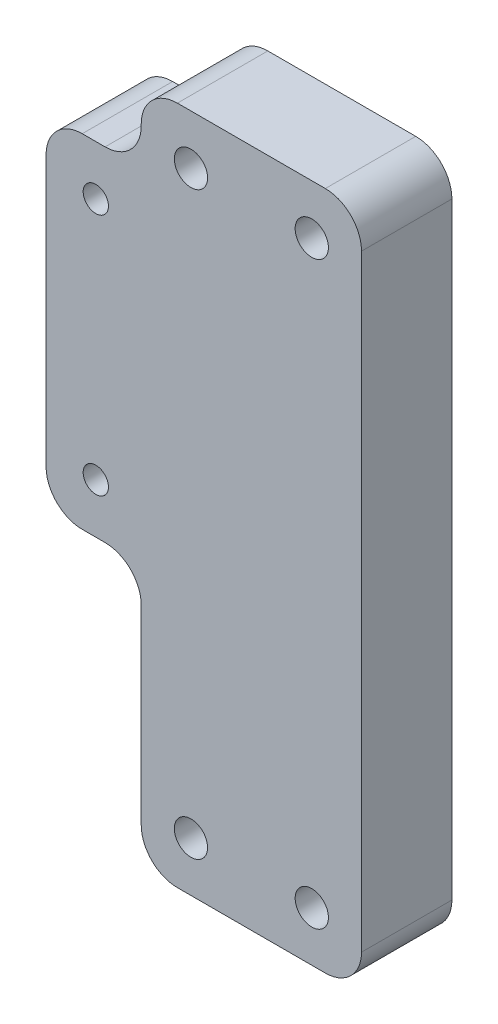
ISO-10303-21;
HEADER;
FILE_DESCRIPTION(('STEP AP214'),'2;1');
FILE_NAME('part.step','',(''),(''),'','','');
FILE_SCHEMA(('AUTOMOTIVE_DESIGN { 1 0 10303 214 1 1 1 1 }'));
ENDSEC;
DATA;
#1=APPLICATION_CONTEXT('core data for automotive mechanical design processes');
#2=APPLICATION_PROTOCOL_DEFINITION('international standard','automotive_design',2000,#1);
#3=PRODUCT_CONTEXT('',#1,'mechanical');
#4=PRODUCT('Part','Part','',(#3));
#5=PRODUCT_RELATED_PRODUCT_CATEGORY('part','',(#4));
#6=PRODUCT_DEFINITION_FORMATION('','',#4);
#7=PRODUCT_DEFINITION_CONTEXT('part definition',#1,'design');
#8=PRODUCT_DEFINITION('design','',#6,#7);
#9=PRODUCT_DEFINITION_SHAPE('','',#8);
#10=(LENGTH_UNIT() NAMED_UNIT(*) SI_UNIT(.MILLI.,.METRE.));
#11=(NAMED_UNIT(*) PLANE_ANGLE_UNIT() SI_UNIT($,.RADIAN.));
#12=(NAMED_UNIT(*) SI_UNIT($,.STERADIAN.) SOLID_ANGLE_UNIT());
#13=UNCERTAINTY_MEASURE_WITH_UNIT(LENGTH_MEASURE(1.E-05),#10,'distance_accuracy_value','');
#14=(GEOMETRIC_REPRESENTATION_CONTEXT(3) GLOBAL_UNCERTAINTY_ASSIGNED_CONTEXT((#13)) GLOBAL_UNIT_ASSIGNED_CONTEXT((#10,
#11,#12)) REPRESENTATION_CONTEXT('',''));
#15=CARTESIAN_POINT('',(0.,0.,0.));
#16=DIRECTION('',(0.,0.,1.));
#17=DIRECTION('',(1.,0.,0.));
#18=AXIS2_PLACEMENT_3D('',#15,#16,#17);
#19=CARTESIAN_POINT('',(-33.9932404035084,-3.58249069152293,6.35));
#20=DIRECTION('',(0.,0.,1.));
#21=DIRECTION('',(1.,0.,0.));
#22=AXIS2_PLACEMENT_3D('',#19,#20,#21);
#23=PLANE('',#22);
#24=CARTESIAN_POINT('',(-50.1132404035084,-9.73674069152292,6.35));
#25=DIRECTION('',(0.,0.,1.));
#26=DIRECTION('',(1.,0.,0.));
#27=AXIS2_PLACEMENT_3D('',#24,#25,#26);
#28=CIRCLE('',#27,0.889000000000003);
#29=CARTESIAN_POINT('',(-49.2242404035084,-9.73674069152292,6.35));
#30=VERTEX_POINT('',#29);
#31=EDGE_CURVE('E351',#30,#30,#28,.T.);
#32=ORIENTED_EDGE('',*,*,#31,.F.);
#33=EDGE_LOOP('',(#32));
#34=FACE_BOUND('',#33,.T.);
#35=CARTESIAN_POINT('',(-43.4307404035084,-45.2699906915229,6.35));
#36=DIRECTION('',(0.,0.,1.));
#37=DIRECTION('',(1.,0.,0.));
#38=AXIS2_PLACEMENT_3D('',#35,#36,#37);
#39=CIRCLE('',#38,1.1684);
#40=CARTESIAN_POINT('',(-42.2623404035084,-45.2699906915229,6.35));
#41=VERTEX_POINT('',#40);
#42=EDGE_CURVE('E363',#41,#41,#39,.T.);
#43=ORIENTED_EDGE('',*,*,#42,.F.);
#44=EDGE_LOOP('',(#43));
#45=FACE_BOUND('',#44,.T.);
#46=CARTESIAN_POINT('',(-43.4307404035084,-4.53499069152293,6.35));
#47=DIRECTION('',(0.,0.,1.));
#48=DIRECTION('',(1.,0.,0.));
#49=AXIS2_PLACEMENT_3D('',#46,#47,#48);
#50=CIRCLE('',#49,1.1684);
#51=CARTESIAN_POINT('',(-42.2623404035084,-4.53499069152293,6.35));
#52=VERTEX_POINT('',#51);
#53=EDGE_CURVE('E181',#52,#52,#50,.T.);
#54=ORIENTED_EDGE('',*,*,#53,.F.);
#55=EDGE_LOOP('',(#54));
#56=FACE_BOUND('',#55,.T.);
#57=CARTESIAN_POINT('',(-33.9932404035084,-3.58249069152293,6.35));
#58=DIRECTION('',(0.,0.,1.));
#59=DIRECTION('',(1.,0.,0.));
#60=AXIS2_PLACEMENT_3D('',#57,#58,#59);
#61=CIRCLE('',#60,2.54);
#62=CARTESIAN_POINT('',(-31.4532404035084,-3.58249069152293,6.35));
#63=VERTEX_POINT('',#62);
#64=CARTESIAN_POINT('',(-33.9932404035084,-1.04249069152293,6.35));
#65=VERTEX_POINT('',#64);
#66=EDGE_CURVE('E208',#63,#65,#61,.T.);
#67=ORIENTED_EDGE('',*,*,#66,.T.);
#68=DIRECTION('',(-1.,0.,0.));
#69=VECTOR('',#68,1.);
#70=CARTESIAN_POINT('',(-44.3832404035084,-1.04249069152293,6.35));
#71=LINE('',#70,#69);
#72=CARTESIAN_POINT('',(-44.3832404035084,-1.04249069152293,6.35));
#73=VERTEX_POINT('',#72);
#74=EDGE_CURVE('E116',#65,#73,#71,.T.);
#75=ORIENTED_EDGE('',*,*,#74,.T.);
#76=CARTESIAN_POINT('',(-44.3832404035084,-3.58249069152293,6.35));
#77=DIRECTION('',(0.,0.,1.));
#78=DIRECTION('',(1.,0.,0.));
#79=AXIS2_PLACEMENT_3D('',#76,#77,#78);
#80=CIRCLE('',#79,2.54);
#81=CARTESIAN_POINT('',(-46.9232404035084,-3.58249069152294,6.35));
#82=VERTEX_POINT('',#81);
#83=EDGE_CURVE('E247',#73,#82,#80,.T.);
#84=ORIENTED_EDGE('',*,*,#83,.T.);
#85=DIRECTION('',(0.,-1.,0.));
#86=VECTOR('',#85,1.);
#87=CARTESIAN_POINT('',(-46.9232404035084,-3.58249069152294,6.35));
#88=LINE('',#87,#86);
#89=CARTESIAN_POINT('',(-46.9232404035084,-3.7042406915229,6.35));
#90=VERTEX_POINT('',#89);
#91=EDGE_CURVE('E266',#82,#90,#88,.T.);
#92=ORIENTED_EDGE('',*,*,#91,.T.);
#93=CARTESIAN_POINT('',(-49.4632404035084,-3.70424069152292,6.35));
#94=DIRECTION('',(0.,0.,-1.));
#95=DIRECTION('',(-1.,0.,0.));
#96=AXIS2_PLACEMENT_3D('',#93,#94,#95);
#97=CIRCLE('',#96,2.54);
#98=CARTESIAN_POINT('',(-49.4632404035084,-6.24424069152292,6.35));
#99=VERTEX_POINT('',#98);
#100=EDGE_CURVE('E263',#90,#99,#97,.T.);
#101=ORIENTED_EDGE('',*,*,#100,.T.);
#102=DIRECTION('',(-1.,0.,0.));
#103=VECTOR('',#102,1.);
#104=CARTESIAN_POINT('',(-51.0657404035084,-6.24424069152292,6.35));
#105=LINE('',#104,#103);
#106=CARTESIAN_POINT('',(-51.0657404035084,-6.24424069152292,6.35));
#107=VERTEX_POINT('',#106);
#108=EDGE_CURVE('E265',#99,#107,#105,.T.);
#109=ORIENTED_EDGE('',*,*,#108,.T.);
#110=CARTESIAN_POINT('',(-51.0657404035084,-8.78424069152292,6.35));
#111=DIRECTION('',(0.,0.,1.));
#112=DIRECTION('',(-1.,0.,0.));
#113=AXIS2_PLACEMENT_3D('',#110,#111,#112);
#114=CIRCLE('',#113,2.54);
#115=CARTESIAN_POINT('',(-53.6057404035084,-8.78424069152294,6.35));
#116=VERTEX_POINT('',#115);
#117=EDGE_CURVE('E268',#107,#116,#114,.T.);
#118=ORIENTED_EDGE('',*,*,#117,.T.);
#119=DIRECTION('',(0.,-1.,0.));
#120=VECTOR('',#119,1.);
#121=CARTESIAN_POINT('',(-53.6057404035084,-8.78424069152294,6.35));
#122=LINE('',#121,#120);
#123=CARTESIAN_POINT('',(-53.6057404035084,-27.7707406915229,6.35));
#124=VERTEX_POINT('',#123);
#125=EDGE_CURVE('E274',#116,#124,#122,.T.);
#126=ORIENTED_EDGE('',*,*,#125,.T.);
#127=CARTESIAN_POINT('',(-51.0657404035084,-27.7707406915229,6.35));
#128=DIRECTION('',(0.,0.,1.));
#129=DIRECTION('',(1.,0.,0.));
#130=AXIS2_PLACEMENT_3D('',#127,#128,#129);
#131=CIRCLE('',#130,2.54);
#132=CARTESIAN_POINT('',(-51.0657404035084,-30.3107406915229,6.35));
#133=VERTEX_POINT('',#132);
#134=EDGE_CURVE('E276',#124,#133,#131,.T.);
#135=ORIENTED_EDGE('',*,*,#134,.T.);
#136=DIRECTION('',(1.,0.,0.));
#137=VECTOR('',#136,1.);
#138=CARTESIAN_POINT('',(-49.4632404035084,-30.3107406915229,6.35));
#139=LINE('',#138,#137);
#140=CARTESIAN_POINT('',(-49.4632404035084,-30.3107406915229,6.35));
#141=VERTEX_POINT('',#140);
#142=EDGE_CURVE('E278',#133,#141,#139,.T.);
#143=ORIENTED_EDGE('',*,*,#142,.T.);
#144=CARTESIAN_POINT('',(-49.4632404035084,-32.8507406915229,6.35));
#145=DIRECTION('',(0.,0.,-1.));
#146=DIRECTION('',(1.,0.,0.));
#147=AXIS2_PLACEMENT_3D('',#144,#145,#146);
#148=CIRCLE('',#147,2.54);
#149=CARTESIAN_POINT('',(-46.9232404035084,-32.8507406915229,6.35));
#150=VERTEX_POINT('',#149);
#151=EDGE_CURVE('E280',#141,#150,#148,.T.);
#152=ORIENTED_EDGE('',*,*,#151,.T.);
#153=DIRECTION('',(0.,-1.,0.));
#154=VECTOR('',#153,1.);
#155=CARTESIAN_POINT('',(-46.9232404035084,-46.2224906915229,6.35));
#156=LINE('',#155,#154);
#157=CARTESIAN_POINT('',(-46.9232404035084,-46.2224906915229,6.35));
#158=VERTEX_POINT('',#157);
#159=EDGE_CURVE('E282',#150,#158,#156,.T.);
#160=ORIENTED_EDGE('',*,*,#159,.T.);
#161=CARTESIAN_POINT('',(-44.3832404035084,-46.2224906915229,6.35));
#162=DIRECTION('',(0.,0.,1.));
#163=DIRECTION('',(1.,0.,0.));
#164=AXIS2_PLACEMENT_3D('',#161,#162,#163);
#165=CIRCLE('',#164,2.54);
#166=CARTESIAN_POINT('',(-44.3832404035084,-48.7624906915229,6.35));
#167=VERTEX_POINT('',#166);
#168=EDGE_CURVE('E159',#158,#167,#165,.T.);
#169=ORIENTED_EDGE('',*,*,#168,.T.);
#170=DIRECTION('',(1.,0.,0.));
#171=VECTOR('',#170,1.);
#172=CARTESIAN_POINT('',(-44.3832404035084,-48.7624906915229,6.35));
#173=LINE('',#172,#171);
#174=CARTESIAN_POINT('',(-33.9932404035084,-48.7624906915229,6.35));
#175=VERTEX_POINT('',#174);
#176=EDGE_CURVE('E153',#167,#175,#173,.T.);
#177=ORIENTED_EDGE('',*,*,#176,.T.);
#178=CARTESIAN_POINT('',(-33.9932404035084,-46.2224906915229,6.35));
#179=DIRECTION('',(0.,0.,1.));
#180=DIRECTION('',(-1.,0.,0.));
#181=AXIS2_PLACEMENT_3D('',#178,#179,#180);
#182=CIRCLE('',#181,2.54);
#183=CARTESIAN_POINT('',(-31.4532404035084,-46.2224906915229,6.35));
#184=VERTEX_POINT('',#183);
#185=EDGE_CURVE('E157',#175,#184,#182,.T.);
#186=ORIENTED_EDGE('',*,*,#185,.T.);
#187=DIRECTION('',(0.,1.,0.));
#188=VECTOR('',#187,1.);
#189=CARTESIAN_POINT('',(-31.4532404035084,-3.58249069152293,6.35));
#190=LINE('',#189,#188);
#191=EDGE_CURVE('E49',#184,#63,#190,.T.);
#192=ORIENTED_EDGE('',*,*,#191,.T.);
#193=EDGE_LOOP('',(#67,#75,#84,#92,#101,#109,#118,#126,#135,#143,#152,#160,#169,#177,#186,#192));
#194=FACE_BOUND('',#193,.T.);
#195=CARTESIAN_POINT('',(-34.9457404035084,-4.53499069152293,6.35));
#196=DIRECTION('',(0.,0.,1.));
#197=DIRECTION('',(1.,0.,0.));
#198=AXIS2_PLACEMENT_3D('',#195,#196,#197);
#199=CIRCLE('',#198,1.1684);
#200=CARTESIAN_POINT('',(-33.7773404035084,-4.53499069152293,6.35));
#201=VERTEX_POINT('',#200);
#202=EDGE_CURVE('E369',#201,#201,#199,.T.);
#203=ORIENTED_EDGE('',*,*,#202,.F.);
#204=EDGE_LOOP('',(#203));
#205=FACE_BOUND('',#204,.T.);
#206=CARTESIAN_POINT('',(-34.9457404035084,-45.2699906915229,6.35));
#207=DIRECTION('',(0.,0.,1.));
#208=DIRECTION('',(1.,0.,0.));
#209=AXIS2_PLACEMENT_3D('',#206,#207,#208);
#210=CIRCLE('',#209,1.1684);
#211=CARTESIAN_POINT('',(-33.7773404035084,-45.2699906915229,6.35));
#212=VERTEX_POINT('',#211);
#213=EDGE_CURVE('E357',#212,#212,#210,.T.);
#214=ORIENTED_EDGE('',*,*,#213,.F.);
#215=EDGE_LOOP('',(#214));
#216=FACE_BOUND('',#215,.T.);
#217=CARTESIAN_POINT('',(-50.1132404035084,-26.8182406915229,6.35));
#218=DIRECTION('',(0.,0.,1.));
#219=DIRECTION('',(1.,0.,0.));
#220=AXIS2_PLACEMENT_3D('',#217,#218,#219);
#221=CIRCLE('',#220,0.889000000000003);
#222=CARTESIAN_POINT('',(-49.2242404035084,-26.8182406915229,6.35));
#223=VERTEX_POINT('',#222);
#224=EDGE_CURVE('E342',#223,#223,#221,.T.);
#225=ORIENTED_EDGE('',*,*,#224,.F.);
#226=EDGE_LOOP('',(#225));
#227=FACE_BOUND('',#226,.T.);
#228=ADVANCED_FACE('F32',(#34,#45,#56,#194,#205,#216,#227),#23,.T.);
#229=CARTESIAN_POINT('',(-33.9932404035084,-3.58249069152293,0.));
#230=DIRECTION('',(0.,0.,1.));
#231=DIRECTION('',(1.,0.,0.));
#232=AXIS2_PLACEMENT_3D('',#229,#230,#231);
#233=PLANE('',#232);
#234=CARTESIAN_POINT('',(-50.1132404035084,-9.73674069152292,0.));
#235=DIRECTION('',(0.,0.,1.));
#236=DIRECTION('',(1.,0.,0.));
#237=AXIS2_PLACEMENT_3D('',#234,#235,#236);
#238=CIRCLE('',#237,0.889000000000003);
#239=CARTESIAN_POINT('',(-49.2242404035084,-9.73674069152292,0.));
#240=VERTEX_POINT('',#239);
#241=EDGE_CURVE('E348',#240,#240,#238,.T.);
#242=ORIENTED_EDGE('',*,*,#241,.T.);
#243=EDGE_LOOP('',(#242));
#244=FACE_BOUND('',#243,.T.);
#245=CARTESIAN_POINT('',(-43.4307404035084,-45.2699906915229,0.));
#246=DIRECTION('',(0.,0.,1.));
#247=DIRECTION('',(1.,0.,0.));
#248=AXIS2_PLACEMENT_3D('',#245,#246,#247);
#249=CIRCLE('',#248,1.1684);
#250=CARTESIAN_POINT('',(-42.2623404035084,-45.2699906915229,0.));
#251=VERTEX_POINT('',#250);
#252=EDGE_CURVE('E360',#251,#251,#249,.T.);
#253=ORIENTED_EDGE('',*,*,#252,.T.);
#254=EDGE_LOOP('',(#253));
#255=FACE_BOUND('',#254,.T.);
#256=CARTESIAN_POINT('',(-43.4307404035084,-4.53499069152293,0.));
#257=DIRECTION('',(0.,0.,1.));
#258=DIRECTION('',(1.,0.,0.));
#259=AXIS2_PLACEMENT_3D('',#256,#257,#258);
#260=CIRCLE('',#259,1.1684);
#261=CARTESIAN_POINT('',(-42.2623404035084,-4.53499069152293,0.));
#262=VERTEX_POINT('',#261);
#263=EDGE_CURVE('E372',#262,#262,#260,.T.);
#264=ORIENTED_EDGE('',*,*,#263,.T.);
#265=EDGE_LOOP('',(#264));
#266=FACE_BOUND('',#265,.T.);
#267=CARTESIAN_POINT('',(-33.9932404035084,-3.58249069152293,0.));
#268=DIRECTION('',(0.,0.,1.));
#269=DIRECTION('',(1.,0.,0.));
#270=AXIS2_PLACEMENT_3D('',#267,#268,#269);
#271=CIRCLE('',#270,2.54);
#272=CARTESIAN_POINT('',(-31.4532404035084,-3.58249069152293,0.));
#273=VERTEX_POINT('',#272);
#274=CARTESIAN_POINT('',(-33.9932404035084,-1.04249069152293,0.));
#275=VERTEX_POINT('',#274);
#276=EDGE_CURVE('E177',#273,#275,#271,.T.);
#277=ORIENTED_EDGE('',*,*,#276,.F.);
#278=DIRECTION('',(0.,1.,0.));
#279=VECTOR('',#278,1.);
#280=CARTESIAN_POINT('',(-31.4532404035084,-3.58249069152293,0.));
#281=LINE('',#280,#279);
#282=CARTESIAN_POINT('',(-31.4532404035084,-46.2224906915229,0.));
#283=VERTEX_POINT('',#282);
#284=EDGE_CURVE('E108',#283,#273,#281,.T.);
#285=ORIENTED_EDGE('',*,*,#284,.F.);
#286=CARTESIAN_POINT('',(-33.9932404035084,-46.2224906915229,0.));
#287=DIRECTION('',(0.,0.,1.));
#288=DIRECTION('',(-1.,0.,0.));
#289=AXIS2_PLACEMENT_3D('',#286,#287,#288);
#290=CIRCLE('',#289,2.54);
#291=CARTESIAN_POINT('',(-33.9932404035084,-48.7624906915229,0.));
#292=VERTEX_POINT('',#291);
#293=EDGE_CURVE('E102',#292,#283,#290,.T.);
#294=ORIENTED_EDGE('',*,*,#293,.F.);
#295=DIRECTION('',(1.,0.,0.));
#296=VECTOR('',#295,1.);
#297=CARTESIAN_POINT('',(-44.3832404035084,-48.7624906915229,0.));
#298=LINE('',#297,#296);
#299=CARTESIAN_POINT('',(-44.3832404035084,-48.7624906915229,0.));
#300=VERTEX_POINT('',#299);
#301=EDGE_CURVE('E167',#300,#292,#298,.T.);
#302=ORIENTED_EDGE('',*,*,#301,.F.);
#303=CARTESIAN_POINT('',(-44.3832404035084,-46.2224906915229,0.));
#304=DIRECTION('',(0.,0.,1.));
#305=DIRECTION('',(1.,0.,0.));
#306=AXIS2_PLACEMENT_3D('',#303,#304,#305);
#307=CIRCLE('',#306,2.54);
#308=CARTESIAN_POINT('',(-46.9232404035084,-46.2224906915229,0.));
#309=VERTEX_POINT('',#308);
#310=EDGE_CURVE('E203',#309,#300,#307,.T.);
#311=ORIENTED_EDGE('',*,*,#310,.F.);
#312=DIRECTION('',(0.,-1.,0.));
#313=VECTOR('',#312,1.);
#314=CARTESIAN_POINT('',(-46.9232404035084,-46.2224906915229,0.));
#315=LINE('',#314,#313);
#316=CARTESIAN_POINT('',(-46.9232404035084,-32.8507406915229,0.));
#317=VERTEX_POINT('',#316);
#318=EDGE_CURVE('E201',#317,#309,#315,.T.);
#319=ORIENTED_EDGE('',*,*,#318,.F.);
#320=CARTESIAN_POINT('',(-49.4632404035084,-32.8507406915229,0.));
#321=DIRECTION('',(0.,0.,-1.));
#322=DIRECTION('',(1.,0.,0.));
#323=AXIS2_PLACEMENT_3D('',#320,#321,#322);
#324=CIRCLE('',#323,2.54);
#325=CARTESIAN_POINT('',(-49.4632404035084,-30.3107406915229,0.));
#326=VERTEX_POINT('',#325);
#327=EDGE_CURVE('E199',#326,#317,#324,.T.);
#328=ORIENTED_EDGE('',*,*,#327,.F.);
#329=DIRECTION('',(1.,0.,0.));
#330=VECTOR('',#329,1.);
#331=CARTESIAN_POINT('',(-49.4632404035084,-30.3107406915229,0.));
#332=LINE('',#331,#330);
#333=CARTESIAN_POINT('',(-51.0657404035084,-30.3107406915229,0.));
#334=VERTEX_POINT('',#333);
#335=EDGE_CURVE('E197',#334,#326,#332,.T.);
#336=ORIENTED_EDGE('',*,*,#335,.F.);
#337=CARTESIAN_POINT('',(-51.0657404035084,-27.7707406915229,0.));
#338=DIRECTION('',(0.,0.,1.));
#339=DIRECTION('',(1.,0.,0.));
#340=AXIS2_PLACEMENT_3D('',#337,#338,#339);
#341=CIRCLE('',#340,2.54);
#342=CARTESIAN_POINT('',(-53.6057404035084,-27.7707406915229,0.));
#343=VERTEX_POINT('',#342);
#344=EDGE_CURVE('E195',#343,#334,#341,.T.);
#345=ORIENTED_EDGE('',*,*,#344,.F.);
#346=DIRECTION('',(0.,-1.,0.));
#347=VECTOR('',#346,1.);
#348=CARTESIAN_POINT('',(-53.6057404035084,-8.78424069152294,0.));
#349=LINE('',#348,#347);
#350=CARTESIAN_POINT('',(-53.6057404035084,-8.78424069152294,0.));
#351=VERTEX_POINT('',#350);
#352=EDGE_CURVE('E193',#351,#343,#349,.T.);
#353=ORIENTED_EDGE('',*,*,#352,.F.);
#354=CARTESIAN_POINT('',(-51.0657404035084,-8.78424069152292,0.));
#355=DIRECTION('',(0.,0.,1.));
#356=DIRECTION('',(-1.,0.,0.));
#357=AXIS2_PLACEMENT_3D('',#354,#355,#356);
#358=CIRCLE('',#357,2.54);
#359=CARTESIAN_POINT('',(-51.0657404035084,-6.24424069152292,0.));
#360=VERTEX_POINT('',#359);
#361=EDGE_CURVE('E191',#360,#351,#358,.T.);
#362=ORIENTED_EDGE('',*,*,#361,.F.);
#363=DIRECTION('',(-1.,0.,0.));
#364=VECTOR('',#363,1.);
#365=CARTESIAN_POINT('',(-51.0657404035084,-6.24424069152292,0.));
#366=LINE('',#365,#364);
#367=CARTESIAN_POINT('',(-49.4632404035084,-6.24424069152292,0.));
#368=VERTEX_POINT('',#367);
#369=EDGE_CURVE('E189',#368,#360,#366,.T.);
#370=ORIENTED_EDGE('',*,*,#369,.F.);
#371=CARTESIAN_POINT('',(-49.4632404035084,-3.70424069152292,0.));
#372=DIRECTION('',(0.,0.,-1.));
#373=DIRECTION('',(-1.,0.,0.));
#374=AXIS2_PLACEMENT_3D('',#371,#372,#373);
#375=CIRCLE('',#374,2.54);
#376=CARTESIAN_POINT('',(-46.9232404035084,-3.7042406915229,0.));
#377=VERTEX_POINT('',#376);
#378=EDGE_CURVE('E187',#377,#368,#375,.T.);
#379=ORIENTED_EDGE('',*,*,#378,.F.);
#380=DIRECTION('',(0.,-1.,0.));
#381=VECTOR('',#380,1.);
#382=CARTESIAN_POINT('',(-46.9232404035084,-3.58249069152294,0.));
#383=LINE('',#382,#381);
#384=CARTESIAN_POINT('',(-46.9232404035084,-3.58249069152294,0.));
#385=VERTEX_POINT('',#384);
#386=EDGE_CURVE('E185',#385,#377,#383,.T.);
#387=ORIENTED_EDGE('',*,*,#386,.F.);
#388=CARTESIAN_POINT('',(-44.3832404035084,-3.58249069152293,0.));
#389=DIRECTION('',(0.,0.,1.));
#390=DIRECTION('',(1.,0.,0.));
#391=AXIS2_PLACEMENT_3D('',#388,#389,#390);
#392=CIRCLE('',#391,2.54);
#393=CARTESIAN_POINT('',(-44.3832404035084,-1.04249069152293,0.));
#394=VERTEX_POINT('',#393);
#395=EDGE_CURVE('E183',#394,#385,#392,.T.);
#396=ORIENTED_EDGE('',*,*,#395,.F.);
#397=DIRECTION('',(-1.,0.,0.));
#398=VECTOR('',#397,1.);
#399=CARTESIAN_POINT('',(-44.3832404035084,-1.04249069152293,0.));
#400=LINE('',#399,#398);
#401=EDGE_CURVE('E180',#275,#394,#400,.T.);
#402=ORIENTED_EDGE('',*,*,#401,.F.);
#403=EDGE_LOOP('',(#277,#285,#294,#302,#311,#319,#328,#336,#345,#353,#362,#370,#379,#387,#396,#402));
#404=FACE_BOUND('',#403,.T.);
#405=CARTESIAN_POINT('',(-34.9457404035084,-4.53499069152293,0.));
#406=DIRECTION('',(0.,0.,1.));
#407=DIRECTION('',(1.,0.,0.));
#408=AXIS2_PLACEMENT_3D('',#405,#406,#407);
#409=CIRCLE('',#408,1.1684);
#410=CARTESIAN_POINT('',(-33.7773404035084,-4.53499069152293,0.));
#411=VERTEX_POINT('',#410);
#412=EDGE_CURVE('E366',#411,#411,#409,.T.);
#413=ORIENTED_EDGE('',*,*,#412,.T.);
#414=EDGE_LOOP('',(#413));
#415=FACE_BOUND('',#414,.T.);
#416=CARTESIAN_POINT('',(-34.9457404035084,-45.2699906915229,0.));
#417=DIRECTION('',(0.,0.,1.));
#418=DIRECTION('',(1.,0.,0.));
#419=AXIS2_PLACEMENT_3D('',#416,#417,#418);
#420=CIRCLE('',#419,1.1684);
#421=CARTESIAN_POINT('',(-33.7773404035084,-45.2699906915229,0.));
#422=VERTEX_POINT('',#421);
#423=EDGE_CURVE('E354',#422,#422,#420,.T.);
#424=ORIENTED_EDGE('',*,*,#423,.T.);
#425=EDGE_LOOP('',(#424));
#426=FACE_BOUND('',#425,.T.);
#427=CARTESIAN_POINT('',(-50.1132404035084,-26.8182406915229,0.));
#428=DIRECTION('',(0.,0.,1.));
#429=DIRECTION('',(1.,0.,0.));
#430=AXIS2_PLACEMENT_3D('',#427,#428,#429);
#431=CIRCLE('',#430,0.889000000000003);
#432=CARTESIAN_POINT('',(-49.2242404035084,-26.8182406915229,0.));
#433=VERTEX_POINT('',#432);
#434=EDGE_CURVE('E345',#433,#433,#431,.T.);
#435=ORIENTED_EDGE('',*,*,#434,.T.);
#436=EDGE_LOOP('',(#435));
#437=FACE_BOUND('',#436,.T.);
#438=ADVANCED_FACE('F251',(#244,#255,#266,#404,#415,#426,#437),#233,.F.);
#439=CARTESIAN_POINT('',(-33.9932404035084,-3.58249069152293,6.35));
#440=DIRECTION('',(0.,0.,-1.));
#441=DIRECTION('',(-1.,0.,0.));
#442=AXIS2_PLACEMENT_3D('',#439,#440,#441);
#443=CYLINDRICAL_SURFACE('',#442,2.54);
#444=ORIENTED_EDGE('',*,*,#276,.T.);
#445=DIRECTION('',(0.,0.,-1.));
#446=VECTOR('',#445,1.);
#447=CARTESIAN_POINT('',(-33.9932404035084,-1.04249069152293,6.35));
#448=LINE('',#447,#446);
#449=EDGE_CURVE('E11',#65,#275,#448,.T.);
#450=ORIENTED_EDGE('',*,*,#449,.F.);
#451=ORIENTED_EDGE('',*,*,#66,.F.);
#452=DIRECTION('',(0.,0.,-1.));
#453=VECTOR('',#452,1.);
#454=CARTESIAN_POINT('',(-31.4532404035084,-3.58249069152293,6.35));
#455=LINE('',#454,#453);
#456=EDGE_CURVE('E173',#63,#273,#455,.T.);
#457=ORIENTED_EDGE('',*,*,#456,.T.);
#458=EDGE_LOOP('',(#444,#450,#451,#457));
#459=FACE_BOUND('',#458,.T.);
#460=ADVANCED_FACE('F34',(#459),#443,.T.);
#461=CARTESIAN_POINT('',(-44.3832404035084,-1.04249069152293,6.35));
#462=DIRECTION('',(0.,-1.,0.));
#463=DIRECTION('',(0.,0.,-1.));
#464=AXIS2_PLACEMENT_3D('',#461,#462,#463);
#465=PLANE('',#464);
#466=ORIENTED_EDGE('',*,*,#401,.T.);
#467=DIRECTION('',(0.,0.,-1.));
#468=VECTOR('',#467,1.);
#469=CARTESIAN_POINT('',(-44.3832404035084,-1.04249069152293,6.35));
#470=LINE('',#469,#468);
#471=EDGE_CURVE('E41',#73,#394,#470,.T.);
#472=ORIENTED_EDGE('',*,*,#471,.F.);
#473=ORIENTED_EDGE('',*,*,#74,.F.);
#474=ORIENTED_EDGE('',*,*,#449,.T.);
#475=EDGE_LOOP('',(#466,#472,#473,#474));
#476=FACE_BOUND('',#475,.T.);
#477=ADVANCED_FACE('F539',(#476),#465,.F.);
#478=CARTESIAN_POINT('',(-44.3832404035084,-3.58249069152293,6.35));
#479=DIRECTION('',(0.,0.,-1.));
#480=DIRECTION('',(-1.,0.,0.));
#481=AXIS2_PLACEMENT_3D('',#478,#479,#480);
#482=CYLINDRICAL_SURFACE('',#481,2.54);
#483=ORIENTED_EDGE('',*,*,#395,.T.);
#484=DIRECTION('',(0.,0.,-1.));
#485=VECTOR('',#484,1.);
#486=CARTESIAN_POINT('',(-46.9232404035084,-3.58249069152294,6.35));
#487=LINE('',#486,#485);
#488=EDGE_CURVE('E239',#82,#385,#487,.T.);
#489=ORIENTED_EDGE('',*,*,#488,.F.);
#490=ORIENTED_EDGE('',*,*,#83,.F.);
#491=ORIENTED_EDGE('',*,*,#471,.T.);
#492=EDGE_LOOP('',(#483,#489,#490,#491));
#493=FACE_BOUND('',#492,.T.);
#494=ADVANCED_FACE('F245',(#493),#482,.T.);
#495=CARTESIAN_POINT('',(-46.9232404035084,-3.58249069152294,6.35));
#496=DIRECTION('',(1.,0.,0.));
#497=DIRECTION('',(0.,0.,-1.));
#498=AXIS2_PLACEMENT_3D('',#495,#496,#497);
#499=PLANE('',#498);
#500=ORIENTED_EDGE('',*,*,#386,.T.);
#501=DIRECTION('',(0.,0.,-1.));
#502=VECTOR('',#501,1.);
#503=CARTESIAN_POINT('',(-46.9232404035084,-3.7042406915229,6.35));
#504=LINE('',#503,#502);
#505=EDGE_CURVE('E236',#90,#377,#504,.T.);
#506=ORIENTED_EDGE('',*,*,#505,.F.);
#507=ORIENTED_EDGE('',*,*,#91,.F.);
#508=ORIENTED_EDGE('',*,*,#488,.T.);
#509=EDGE_LOOP('',(#500,#506,#507,#508));
#510=FACE_BOUND('',#509,.T.);
#511=ADVANCED_FACE('F257',(#510),#499,.F.);
#512=CARTESIAN_POINT('',(-49.4632404035084,-3.70424069152292,6.35));
#513=DIRECTION('',(0.,0.,-1.));
#514=DIRECTION('',(-1.,0.,0.));
#515=AXIS2_PLACEMENT_3D('',#512,#513,#514);
#516=CYLINDRICAL_SURFACE('',#515,2.54);
#517=ORIENTED_EDGE('',*,*,#378,.T.);
#518=DIRECTION('',(0.,0.,-1.));
#519=VECTOR('',#518,1.);
#520=CARTESIAN_POINT('',(-49.4632404035084,-6.24424069152292,6.35));
#521=LINE('',#520,#519);
#522=EDGE_CURVE('E233',#99,#368,#521,.T.);
#523=ORIENTED_EDGE('',*,*,#522,.F.);
#524=ORIENTED_EDGE('',*,*,#100,.F.);
#525=ORIENTED_EDGE('',*,*,#505,.T.);
#526=EDGE_LOOP('',(#517,#523,#524,#525));
#527=FACE_BOUND('',#526,.T.);
#528=ADVANCED_FACE('F261',(#527),#516,.F.);
#529=CARTESIAN_POINT('',(-51.0657404035084,-6.24424069152292,6.35));
#530=DIRECTION('',(0.,-1.,0.));
#531=DIRECTION('',(0.,0.,-1.));
#532=AXIS2_PLACEMENT_3D('',#529,#530,#531);
#533=PLANE('',#532);
#534=ORIENTED_EDGE('',*,*,#369,.T.);
#535=DIRECTION('',(0.,0.,-1.));
#536=VECTOR('',#535,1.);
#537=CARTESIAN_POINT('',(-51.0657404035084,-6.24424069152292,6.35));
#538=LINE('',#537,#536);
#539=EDGE_CURVE('E230',#107,#360,#538,.T.);
#540=ORIENTED_EDGE('',*,*,#539,.F.);
#541=ORIENTED_EDGE('',*,*,#108,.F.);
#542=ORIENTED_EDGE('',*,*,#522,.T.);
#543=EDGE_LOOP('',(#534,#540,#541,#542));
#544=FACE_BOUND('',#543,.T.);
#545=ADVANCED_FACE('F504',(#544),#533,.F.);
#546=CARTESIAN_POINT('',(-51.0657404035084,-8.78424069152292,6.35));
#547=DIRECTION('',(0.,0.,-1.));
#548=DIRECTION('',(-1.,0.,0.));
#549=AXIS2_PLACEMENT_3D('',#546,#547,#548);
#550=CYLINDRICAL_SURFACE('',#549,2.54);
#551=ORIENTED_EDGE('',*,*,#361,.T.);
#552=DIRECTION('',(0.,0.,-1.));
#553=VECTOR('',#552,1.);
#554=CARTESIAN_POINT('',(-53.6057404035084,-8.78424069152294,6.35));
#555=LINE('',#554,#553);
#556=EDGE_CURVE('E227',#116,#351,#555,.T.);
#557=ORIENTED_EDGE('',*,*,#556,.F.);
#558=ORIENTED_EDGE('',*,*,#117,.F.);
#559=ORIENTED_EDGE('',*,*,#539,.T.);
#560=EDGE_LOOP('',(#551,#557,#558,#559));
#561=FACE_BOUND('',#560,.T.);
#562=ADVANCED_FACE('F494',(#561),#550,.T.);
#563=CARTESIAN_POINT('',(-53.6057404035084,-8.78424069152294,6.35));
#564=DIRECTION('',(1.,0.,0.));
#565=DIRECTION('',(0.,0.,-1.));
#566=AXIS2_PLACEMENT_3D('',#563,#564,#565);
#567=PLANE('',#566);
#568=ORIENTED_EDGE('',*,*,#352,.T.);
#569=DIRECTION('',(0.,0.,-1.));
#570=VECTOR('',#569,1.);
#571=CARTESIAN_POINT('',(-53.6057404035084,-27.7707406915229,6.35));
#572=LINE('',#571,#570);
#573=EDGE_CURVE('E224',#124,#343,#572,.T.);
#574=ORIENTED_EDGE('',*,*,#573,.F.);
#575=ORIENTED_EDGE('',*,*,#125,.F.);
#576=ORIENTED_EDGE('',*,*,#556,.T.);
#577=EDGE_LOOP('',(#568,#574,#575,#576));
#578=FACE_BOUND('',#577,.T.);
#579=ADVANCED_FACE('F484',(#578),#567,.F.);
#580=CARTESIAN_POINT('',(-51.0657404035084,-27.7707406915229,6.35));
#581=DIRECTION('',(0.,0.,-1.));
#582=DIRECTION('',(-1.,0.,0.));
#583=AXIS2_PLACEMENT_3D('',#580,#581,#582);
#584=CYLINDRICAL_SURFACE('',#583,2.54);
#585=ORIENTED_EDGE('',*,*,#344,.T.);
#586=DIRECTION('',(0.,0.,-1.));
#587=VECTOR('',#586,1.);
#588=CARTESIAN_POINT('',(-51.0657404035084,-30.3107406915229,6.35));
#589=LINE('',#588,#587);
#590=EDGE_CURVE('E221',#133,#334,#589,.T.);
#591=ORIENTED_EDGE('',*,*,#590,.F.);
#592=ORIENTED_EDGE('',*,*,#134,.F.);
#593=ORIENTED_EDGE('',*,*,#573,.T.);
#594=EDGE_LOOP('',(#585,#591,#592,#593));
#595=FACE_BOUND('',#594,.T.);
#596=ADVANCED_FACE('F474',(#595),#584,.T.);
#597=CARTESIAN_POINT('',(-49.4632404035084,-30.3107406915229,6.35));
#598=DIRECTION('',(0.,1.,0.));
#599=DIRECTION('',(0.,0.,1.));
#600=AXIS2_PLACEMENT_3D('',#597,#598,#599);
#601=PLANE('',#600);
#602=ORIENTED_EDGE('',*,*,#335,.T.);
#603=DIRECTION('',(0.,0.,-1.));
#604=VECTOR('',#603,1.);
#605=CARTESIAN_POINT('',(-49.4632404035084,-30.3107406915229,6.35));
#606=LINE('',#605,#604);
#607=EDGE_CURVE('E218',#141,#326,#606,.T.);
#608=ORIENTED_EDGE('',*,*,#607,.F.);
#609=ORIENTED_EDGE('',*,*,#142,.F.);
#610=ORIENTED_EDGE('',*,*,#590,.T.);
#611=EDGE_LOOP('',(#602,#608,#609,#610));
#612=FACE_BOUND('',#611,.T.);
#613=ADVANCED_FACE('F464',(#612),#601,.F.);
#614=CARTESIAN_POINT('',(-49.4632404035084,-32.8507406915229,6.35));
#615=DIRECTION('',(0.,0.,-1.));
#616=DIRECTION('',(-1.,0.,0.));
#617=AXIS2_PLACEMENT_3D('',#614,#615,#616);
#618=CYLINDRICAL_SURFACE('',#617,2.54);
#619=ORIENTED_EDGE('',*,*,#327,.T.);
#620=DIRECTION('',(0.,0.,-1.));
#621=VECTOR('',#620,1.);
#622=CARTESIAN_POINT('',(-46.9232404035084,-32.8507406915229,6.35));
#623=LINE('',#622,#621);
#624=EDGE_CURVE('E215',#150,#317,#623,.T.);
#625=ORIENTED_EDGE('',*,*,#624,.F.);
#626=ORIENTED_EDGE('',*,*,#151,.F.);
#627=ORIENTED_EDGE('',*,*,#607,.T.);
#628=EDGE_LOOP('',(#619,#625,#626,#627));
#629=FACE_BOUND('',#628,.T.);
#630=ADVANCED_FACE('F455',(#629),#618,.F.);
#631=CARTESIAN_POINT('',(-46.9232404035084,-46.2224906915229,6.35));
#632=DIRECTION('',(1.,0.,0.));
#633=DIRECTION('',(0.,0.,-1.));
#634=AXIS2_PLACEMENT_3D('',#631,#632,#633);
#635=PLANE('',#634);
#636=ORIENTED_EDGE('',*,*,#318,.T.);
#637=DIRECTION('',(0.,0.,-1.));
#638=VECTOR('',#637,1.);
#639=CARTESIAN_POINT('',(-46.9232404035084,-46.2224906915229,6.35));
#640=LINE('',#639,#638);
#641=EDGE_CURVE('E212',#158,#309,#640,.T.);
#642=ORIENTED_EDGE('',*,*,#641,.F.);
#643=ORIENTED_EDGE('',*,*,#159,.F.);
#644=ORIENTED_EDGE('',*,*,#624,.T.);
#645=EDGE_LOOP('',(#636,#642,#643,#644));
#646=FACE_BOUND('',#645,.T.);
#647=ADVANCED_FACE('F288',(#646),#635,.F.);
#648=CARTESIAN_POINT('',(-44.3832404035084,-46.2224906915229,6.35));
#649=DIRECTION('',(0.,0.,-1.));
#650=DIRECTION('',(-1.,0.,0.));
#651=AXIS2_PLACEMENT_3D('',#648,#649,#650);
#652=CYLINDRICAL_SURFACE('',#651,2.54);
#653=ORIENTED_EDGE('',*,*,#310,.T.);
#654=DIRECTION('',(0.,0.,-1.));
#655=VECTOR('',#654,1.);
#656=CARTESIAN_POINT('',(-44.3832404035084,-48.7624906915229,6.35));
#657=LINE('',#656,#655);
#658=EDGE_CURVE('E168',#167,#300,#657,.T.);
#659=ORIENTED_EDGE('',*,*,#658,.F.);
#660=ORIENTED_EDGE('',*,*,#168,.F.);
#661=ORIENTED_EDGE('',*,*,#641,.T.);
#662=EDGE_LOOP('',(#653,#659,#660,#661));
#663=FACE_BOUND('',#662,.T.);
#664=ADVANCED_FACE('F292',(#663),#652,.T.);
#665=CARTESIAN_POINT('',(-44.3832404035084,-48.7624906915229,6.35));
#666=DIRECTION('',(0.,1.,0.));
#667=DIRECTION('',(-1.,0.,0.));
#668=AXIS2_PLACEMENT_3D('',#665,#666,#667);
#669=PLANE('',#668);
#670=ORIENTED_EDGE('',*,*,#301,.T.);
#671=DIRECTION('',(0.,0.,-1.));
#672=VECTOR('',#671,1.);
#673=CARTESIAN_POINT('',(-33.9932404035084,-48.7624906915229,6.35));
#674=LINE('',#673,#672);
#675=EDGE_CURVE('E164',#175,#292,#674,.T.);
#676=ORIENTED_EDGE('',*,*,#675,.F.);
#677=ORIENTED_EDGE('',*,*,#176,.F.);
#678=ORIENTED_EDGE('',*,*,#658,.T.);
#679=EDGE_LOOP('',(#670,#676,#677,#678));
#680=FACE_BOUND('',#679,.T.);
#681=ADVANCED_FACE('F165',(#680),#669,.F.);
#682=CARTESIAN_POINT('',(-33.9932404035084,-46.2224906915229,6.35));
#683=DIRECTION('',(0.,0.,-1.));
#684=DIRECTION('',(-1.,0.,0.));
#685=AXIS2_PLACEMENT_3D('',#682,#683,#684);
#686=CYLINDRICAL_SURFACE('',#685,2.54);
#687=ORIENTED_EDGE('',*,*,#293,.T.);
#688=DIRECTION('',(0.,0.,-1.));
#689=VECTOR('',#688,1.);
#690=CARTESIAN_POINT('',(-31.4532404035084,-46.2224906915229,6.35));
#691=LINE('',#690,#689);
#692=EDGE_CURVE('E169',#184,#283,#691,.T.);
#693=ORIENTED_EDGE('',*,*,#692,.F.);
#694=ORIENTED_EDGE('',*,*,#185,.F.);
#695=ORIENTED_EDGE('',*,*,#675,.T.);
#696=EDGE_LOOP('',(#687,#693,#694,#695));
#697=FACE_BOUND('',#696,.T.);
#698=ADVANCED_FACE('F171',(#697),#686,.T.);
#699=CARTESIAN_POINT('',(-31.4532404035084,-3.58249069152293,6.35));
#700=DIRECTION('',(-1.,0.,0.));
#701=DIRECTION('',(0.,-1.,0.));
#702=AXIS2_PLACEMENT_3D('',#699,#700,#701);
#703=PLANE('',#702);
#704=ORIENTED_EDGE('',*,*,#284,.T.);
#705=ORIENTED_EDGE('',*,*,#456,.F.);
#706=ORIENTED_EDGE('',*,*,#191,.F.);
#707=ORIENTED_EDGE('',*,*,#692,.T.);
#708=EDGE_LOOP('',(#704,#705,#706,#707));
#709=FACE_BOUND('',#708,.T.);
#710=ADVANCED_FACE('F296',(#709),#703,.F.);
#711=CARTESIAN_POINT('',(-43.4307404035084,-4.53499069152293,6.35));
#712=DIRECTION('',(0.,0.,-1.));
#713=DIRECTION('',(-1.,0.,0.));
#714=AXIS2_PLACEMENT_3D('',#711,#712,#713);
#715=CYLINDRICAL_SURFACE('',#714,1.1684);
#716=ORIENTED_EDGE('',*,*,#53,.T.);
#717=EDGE_LOOP('',(#716));
#718=FACE_BOUND('',#717,.T.);
#719=ORIENTED_EDGE('',*,*,#263,.F.);
#720=EDGE_LOOP('',(#719));
#721=FACE_BOUND('',#720,.T.);
#722=ADVANCED_FACE('F298',(#718,#721),#715,.F.);
#723=CARTESIAN_POINT('',(-34.9457404035084,-4.53499069152293,6.35));
#724=DIRECTION('',(0.,0.,-1.));
#725=DIRECTION('',(-1.,0.,0.));
#726=AXIS2_PLACEMENT_3D('',#723,#724,#725);
#727=CYLINDRICAL_SURFACE('',#726,1.1684);
#728=ORIENTED_EDGE('',*,*,#202,.T.);
#729=EDGE_LOOP('',(#728));
#730=FACE_BOUND('',#729,.T.);
#731=ORIENTED_EDGE('',*,*,#412,.F.);
#732=EDGE_LOOP('',(#731));
#733=FACE_BOUND('',#732,.T.);
#734=ADVANCED_FACE('F304',(#730,#733),#727,.F.);
#735=CARTESIAN_POINT('',(-43.4307404035084,-45.2699906915229,6.35));
#736=DIRECTION('',(0.,0.,-1.));
#737=DIRECTION('',(-1.,0.,0.));
#738=AXIS2_PLACEMENT_3D('',#735,#736,#737);
#739=CYLINDRICAL_SURFACE('',#738,1.1684);
#740=ORIENTED_EDGE('',*,*,#42,.T.);
#741=EDGE_LOOP('',(#740));
#742=FACE_BOUND('',#741,.T.);
#743=ORIENTED_EDGE('',*,*,#252,.F.);
#744=EDGE_LOOP('',(#743));
#745=FACE_BOUND('',#744,.T.);
#746=ADVANCED_FACE('F321',(#742,#745),#739,.F.);
#747=CARTESIAN_POINT('',(-34.9457404035084,-45.2699906915229,6.35));
#748=DIRECTION('',(0.,0.,-1.));
#749=DIRECTION('',(-1.,0.,0.));
#750=AXIS2_PLACEMENT_3D('',#747,#748,#749);
#751=CYLINDRICAL_SURFACE('',#750,1.1684);
#752=ORIENTED_EDGE('',*,*,#213,.T.);
#753=EDGE_LOOP('',(#752));
#754=FACE_BOUND('',#753,.T.);
#755=ORIENTED_EDGE('',*,*,#423,.F.);
#756=EDGE_LOOP('',(#755));
#757=FACE_BOUND('',#756,.T.);
#758=ADVANCED_FACE('F325',(#754,#757),#751,.F.);
#759=CARTESIAN_POINT('',(-50.1132404035084,-9.73674069152292,6.35));
#760=DIRECTION('',(0.,0.,-1.));
#761=DIRECTION('',(-1.,0.,0.));
#762=AXIS2_PLACEMENT_3D('',#759,#760,#761);
#763=CYLINDRICAL_SURFACE('',#762,0.889000000000003);
#764=ORIENTED_EDGE('',*,*,#31,.T.);
#765=EDGE_LOOP('',(#764));
#766=FACE_BOUND('',#765,.T.);
#767=ORIENTED_EDGE('',*,*,#241,.F.);
#768=EDGE_LOOP('',(#767));
#769=FACE_BOUND('',#768,.T.);
#770=ADVANCED_FACE('F329',(#766,#769),#763,.F.);
#771=CARTESIAN_POINT('',(-50.1132404035084,-26.8182406915229,6.35));
#772=DIRECTION('',(0.,0.,-1.));
#773=DIRECTION('',(-1.,0.,0.));
#774=AXIS2_PLACEMENT_3D('',#771,#772,#773);
#775=CYLINDRICAL_SURFACE('',#774,0.889000000000003);
#776=ORIENTED_EDGE('',*,*,#224,.T.);
#777=EDGE_LOOP('',(#776));
#778=FACE_BOUND('',#777,.T.);
#779=ORIENTED_EDGE('',*,*,#434,.F.);
#780=EDGE_LOOP('',(#779));
#781=FACE_BOUND('',#780,.T.);
#782=ADVANCED_FACE('F333',(#778,#781),#775,.F.);
#783=CLOSED_SHELL('',(#228,#438,#460,#477,#494,#511,#528,#545,#562,#579,#596,#613,#630,#647,
#664,#681,#698,#710,#722,#734,#746,#758,#770,#782));
#784=MANIFOLD_SOLID_BREP('B2',#783);
#785=ADVANCED_BREP_SHAPE_REPRESENTATION('',(#18,#784),#14);
#786=SHAPE_DEFINITION_REPRESENTATION(#9,#785);
ENDSEC;
END-ISO-10303-21;
